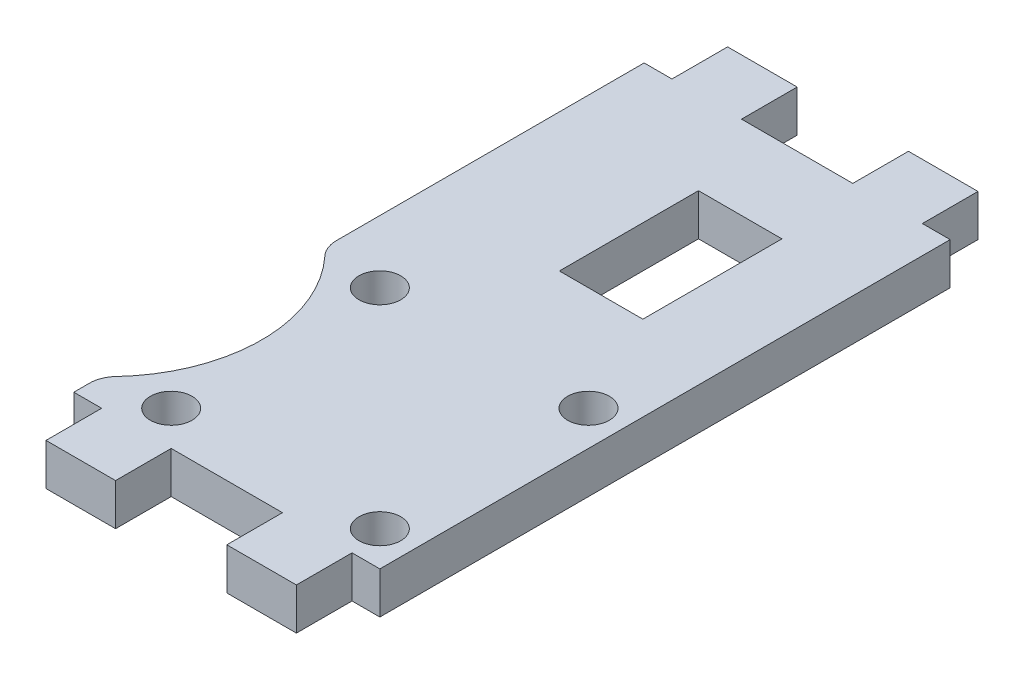
ISO-10303-21;
HEADER;
FILE_DESCRIPTION(('STEP AP214'),'2;1');
FILE_NAME('part.step','',(''),(''),'','','');
FILE_SCHEMA(('AUTOMOTIVE_DESIGN { 1 0 10303 214 1 1 1 1 }'));
ENDSEC;
DATA;
#1=APPLICATION_CONTEXT('core data for automotive mechanical design processes');
#2=APPLICATION_PROTOCOL_DEFINITION('international standard','automotive_design',2000,#1);
#3=PRODUCT_CONTEXT('',#1,'mechanical');
#4=PRODUCT('Part','Part','',(#3));
#5=PRODUCT_RELATED_PRODUCT_CATEGORY('part','',(#4));
#6=PRODUCT_DEFINITION_FORMATION('','',#4);
#7=PRODUCT_DEFINITION_CONTEXT('part definition',#1,'design');
#8=PRODUCT_DEFINITION('design','',#6,#7);
#9=PRODUCT_DEFINITION_SHAPE('','',#8);
#10=(LENGTH_UNIT() NAMED_UNIT(*) SI_UNIT(.MILLI.,.METRE.));
#11=(NAMED_UNIT(*) PLANE_ANGLE_UNIT() SI_UNIT($,.RADIAN.));
#12=(NAMED_UNIT(*) SI_UNIT($,.STERADIAN.) SOLID_ANGLE_UNIT());
#13=UNCERTAINTY_MEASURE_WITH_UNIT(LENGTH_MEASURE(1.E-05),#10,'distance_accuracy_value','');
#14=(GEOMETRIC_REPRESENTATION_CONTEXT(3) GLOBAL_UNCERTAINTY_ASSIGNED_CONTEXT((#13)) GLOBAL_UNIT_ASSIGNED_CONTEXT((#10,
#11,#12)) REPRESENTATION_CONTEXT('',''));
#15=CARTESIAN_POINT('',(0.,0.,0.));
#16=DIRECTION('',(0.,0.,1.));
#17=DIRECTION('',(1.,0.,0.));
#18=AXIS2_PLACEMENT_3D('',#15,#16,#17);
#19=CARTESIAN_POINT('',(-11.,3.,20.5));
#20=DIRECTION('',(1.,0.,0.));
#21=DIRECTION('',(0.,0.,-1.));
#22=AXIS2_PLACEMENT_3D('',#19,#20,#21);
#23=PLANE('',#22);
#24=DIRECTION('',(0.,0.,1.));
#25=VECTOR('',#24,1.);
#26=CARTESIAN_POINT('',(-11.,3.,20.5));
#27=LINE('',#26,#25);
#28=CARTESIAN_POINT('',(-11.,3.,19.3741196746494));
#29=VERTEX_POINT('',#28);
#30=CARTESIAN_POINT('',(-11.,3.,20.5));
#31=VERTEX_POINT('',#30);
#32=EDGE_CURVE('E388',#29,#31,#27,.T.);
#33=ORIENTED_EDGE('',*,*,#32,.F.);
#34=DIRECTION('',(0.,-1.,0.));
#35=VECTOR('',#34,1.);
#36=CARTESIAN_POINT('',(-11.,3.,19.3741196746494));
#37=LINE('',#36,#35);
#38=CARTESIAN_POINT('',(-11.,0.,19.3741196746494));
#39=VERTEX_POINT('',#38);
#40=EDGE_CURVE('E422',#29,#39,#37,.T.);
#41=ORIENTED_EDGE('',*,*,#40,.T.);
#42=DIRECTION('',(0.,0.,1.));
#43=VECTOR('',#42,1.);
#44=CARTESIAN_POINT('',(-11.,0.,20.5));
#45=LINE('',#44,#43);
#46=CARTESIAN_POINT('',(-11.,0.,20.5));
#47=VERTEX_POINT('',#46);
#48=EDGE_CURVE('E406',#39,#47,#45,.T.);
#49=ORIENTED_EDGE('',*,*,#48,.T.);
#50=DIRECTION('',(0.,-1.,0.));
#51=VECTOR('',#50,1.);
#52=CARTESIAN_POINT('',(-11.,3.,20.5));
#53=LINE('',#52,#51);
#54=EDGE_CURVE('E418',#31,#47,#53,.T.);
#55=ORIENTED_EDGE('',*,*,#54,.F.);
#56=EDGE_LOOP('',(#33,#41,#49,#55));
#57=FACE_BOUND('',#56,.T.);
#58=ADVANCED_FACE('F44',(#57),#23,.F.);
#59=CARTESIAN_POINT('',(-11.,3.,20.5));
#60=DIRECTION('',(0.,0.,-1.));
#61=DIRECTION('',(-1.,0.,0.));
#62=AXIS2_PLACEMENT_3D('',#59,#60,#61);
#63=PLANE('',#62);
#64=DIRECTION('',(1.,0.,0.));
#65=VECTOR('',#64,1.);
#66=CARTESIAN_POINT('',(-11.,3.,20.5));
#67=LINE('',#66,#65);
#68=CARTESIAN_POINT('',(-4.00000000000001,3.,20.5));
#69=VERTEX_POINT('',#68);
#70=CARTESIAN_POINT('',(3.99999999999999,3.,20.5));
#71=VERTEX_POINT('',#70);
#72=EDGE_CURVE('E399',#69,#71,#67,.T.);
#73=ORIENTED_EDGE('',*,*,#72,.F.);
#74=DIRECTION('',(0.,1.,0.));
#75=VECTOR('',#74,1.);
#76=CARTESIAN_POINT('',(-4.00000000000001,-6.40312423743285,20.5));
#77=LINE('',#76,#75);
#78=CARTESIAN_POINT('',(-4.00000000000001,0.,20.5));
#79=VERTEX_POINT('',#78);
#80=EDGE_CURVE('E296',#79,#69,#77,.T.);
#81=ORIENTED_EDGE('',*,*,#80,.F.);
#82=DIRECTION('',(1.,0.,0.));
#83=VECTOR('',#82,1.);
#84=CARTESIAN_POINT('',(-11.,0.,20.5));
#85=LINE('',#84,#83);
#86=CARTESIAN_POINT('',(3.99999999999999,0.,20.5));
#87=VERTEX_POINT('',#86);
#88=EDGE_CURVE('E412',#79,#87,#85,.T.);
#89=ORIENTED_EDGE('',*,*,#88,.T.);
#90=DIRECTION('',(0.,1.,0.));
#91=VECTOR('',#90,1.);
#92=CARTESIAN_POINT('',(3.99999999999999,-6.40312423743285,20.5));
#93=LINE('',#92,#91);
#94=EDGE_CURVE('E317',#87,#71,#93,.T.);
#95=ORIENTED_EDGE('',*,*,#94,.T.);
#96=EDGE_LOOP('',(#73,#81,#89,#95));
#97=FACE_BOUND('',#96,.T.);
#98=ADVANCED_FACE('F496',(#97),#63,.F.);
#99=DIRECTION('',(0.,1.,0.));
#100=VECTOR('',#99,1.);
#101=CARTESIAN_POINT('',(8.99999999999997,-6.40312423743285,20.5));
#102=LINE('',#101,#100);
#103=CARTESIAN_POINT('',(8.99999999999997,0.,20.5));
#104=VERTEX_POINT('',#103);
#105=CARTESIAN_POINT('',(8.99999999999997,3.,20.5));
#106=VERTEX_POINT('',#105);
#107=EDGE_CURVE('E325',#104,#106,#102,.T.);
#108=ORIENTED_EDGE('',*,*,#107,.F.);
#109=CARTESIAN_POINT('',(11.,0.,20.5));
#110=VERTEX_POINT('',#109);
#111=EDGE_CURVE('E411',#104,#110,#85,.T.);
#112=ORIENTED_EDGE('',*,*,#111,.T.);
#113=DIRECTION('',(0.,-1.,0.));
#114=VECTOR('',#113,1.);
#115=CARTESIAN_POINT('',(11.,3.,20.5));
#116=LINE('',#115,#114);
#117=CARTESIAN_POINT('',(11.,3.,20.5));
#118=VERTEX_POINT('',#117);
#119=EDGE_CURVE('E398',#118,#110,#116,.T.);
#120=ORIENTED_EDGE('',*,*,#119,.F.);
#121=EDGE_CURVE('E395',#106,#118,#67,.T.);
#122=ORIENTED_EDGE('',*,*,#121,.F.);
#123=EDGE_LOOP('',(#108,#112,#120,#122));
#124=FACE_BOUND('',#123,.T.);
#125=ADVANCED_FACE('F498',(#124),#63,.F.);
#126=CARTESIAN_POINT('',(-11.,3.,-20.5));
#127=DIRECTION('',(0.,0.,1.));
#128=DIRECTION('',(1.,0.,0.));
#129=AXIS2_PLACEMENT_3D('',#126,#127,#128);
#130=PLANE('',#129);
#131=DIRECTION('',(-1.,0.,0.));
#132=VECTOR('',#131,1.);
#133=CARTESIAN_POINT('',(-11.,0.,-20.5));
#134=LINE('',#133,#132);
#135=CARTESIAN_POINT('',(11.,0.,-20.5));
#136=VERTEX_POINT('',#135);
#137=CARTESIAN_POINT('',(9.,0.,-20.5));
#138=VERTEX_POINT('',#137);
#139=EDGE_CURVE('E404',#136,#138,#134,.T.);
#140=ORIENTED_EDGE('',*,*,#139,.T.);
#141=DIRECTION('',(0.,1.,0.));
#142=VECTOR('',#141,1.);
#143=CARTESIAN_POINT('',(9.,-6.40312423743285,-20.5));
#144=LINE('',#143,#142);
#145=CARTESIAN_POINT('',(9.,3.,-20.5));
#146=VERTEX_POINT('',#145);
#147=EDGE_CURVE('E335',#138,#146,#144,.T.);
#148=ORIENTED_EDGE('',*,*,#147,.T.);
#149=DIRECTION('',(-1.,0.,0.));
#150=VECTOR('',#149,1.);
#151=CARTESIAN_POINT('',(-11.,3.,-20.5));
#152=LINE('',#151,#150);
#153=CARTESIAN_POINT('',(11.,3.,-20.5));
#154=VERTEX_POINT('',#153);
#155=EDGE_CURVE('E390',#154,#146,#152,.T.);
#156=ORIENTED_EDGE('',*,*,#155,.F.);
#157=DIRECTION('',(0.,-1.,0.));
#158=VECTOR('',#157,1.);
#159=CARTESIAN_POINT('',(11.,3.,-20.5));
#160=LINE('',#159,#158);
#161=EDGE_CURVE('E425',#154,#136,#160,.T.);
#162=ORIENTED_EDGE('',*,*,#161,.T.);
#163=EDGE_LOOP('',(#140,#148,#156,#162));
#164=FACE_BOUND('',#163,.T.);
#165=ADVANCED_FACE('F520',(#164),#130,.F.);
#166=DIRECTION('',(0.,1.,0.));
#167=VECTOR('',#166,1.);
#168=CARTESIAN_POINT('',(-9.,-6.40312423743285,-20.5));
#169=LINE('',#168,#167);
#170=CARTESIAN_POINT('',(-9.,0.,-20.5));
#171=VERTEX_POINT('',#170);
#172=CARTESIAN_POINT('',(-9.,3.,-20.5));
#173=VERTEX_POINT('',#172);
#174=EDGE_CURVE('E370',#171,#173,#169,.T.);
#175=ORIENTED_EDGE('',*,*,#174,.F.);
#176=CARTESIAN_POINT('',(-11.,0.,-20.5));
#177=VERTEX_POINT('',#176);
#178=EDGE_CURVE('E401',#171,#177,#134,.T.);
#179=ORIENTED_EDGE('',*,*,#178,.T.);
#180=DIRECTION('',(0.,-1.,0.));
#181=VECTOR('',#180,1.);
#182=CARTESIAN_POINT('',(-11.,3.,-20.5));
#183=LINE('',#182,#181);
#184=CARTESIAN_POINT('',(-11.,3.,-20.5));
#185=VERTEX_POINT('',#184);
#186=EDGE_CURVE('E420',#185,#177,#183,.T.);
#187=ORIENTED_EDGE('',*,*,#186,.F.);
#188=EDGE_CURVE('E384',#173,#185,#152,.T.);
#189=ORIENTED_EDGE('',*,*,#188,.F.);
#190=EDGE_LOOP('',(#175,#179,#187,#189));
#191=FACE_BOUND('',#190,.T.);
#192=ADVANCED_FACE('F521',(#191),#130,.F.);
#193=CARTESIAN_POINT('',(11.,3.,20.5));
#194=DIRECTION('',(-1.,0.,0.));
#195=DIRECTION('',(0.,0.,1.));
#196=AXIS2_PLACEMENT_3D('',#193,#194,#195);
#197=PLANE('',#196);
#198=DIRECTION('',(0.,0.,-1.));
#199=VECTOR('',#198,1.);
#200=CARTESIAN_POINT('',(11.,0.,20.5));
#201=LINE('',#200,#199);
#202=EDGE_CURVE('E381',#110,#136,#201,.T.);
#203=ORIENTED_EDGE('',*,*,#202,.T.);
#204=ORIENTED_EDGE('',*,*,#161,.F.);
#205=DIRECTION('',(0.,0.,-1.));
#206=VECTOR('',#205,1.);
#207=CARTESIAN_POINT('',(11.,3.,20.5));
#208=LINE('',#207,#206);
#209=EDGE_CURVE('E385',#118,#154,#208,.T.);
#210=ORIENTED_EDGE('',*,*,#209,.F.);
#211=ORIENTED_EDGE('',*,*,#119,.T.);
#212=EDGE_LOOP('',(#203,#204,#210,#211));
#213=FACE_BOUND('',#212,.T.);
#214=ADVANCED_FACE('F519',(#213),#197,.F.);
#215=CARTESIAN_POINT('',(4.,3.,-20.5));
#216=VERTEX_POINT('',#215);
#217=CARTESIAN_POINT('',(-4.,3.,-20.5));
#218=VERTEX_POINT('',#217);
#219=EDGE_CURVE('E391',#216,#218,#152,.T.);
#220=ORIENTED_EDGE('',*,*,#219,.F.);
#221=DIRECTION('',(0.,1.,0.));
#222=VECTOR('',#221,1.);
#223=CARTESIAN_POINT('',(4.,-6.40312423743285,-20.5));
#224=LINE('',#223,#222);
#225=CARTESIAN_POINT('',(4.,0.,-20.5));
#226=VERTEX_POINT('',#225);
#227=EDGE_CURVE('E341',#226,#216,#224,.T.);
#228=ORIENTED_EDGE('',*,*,#227,.F.);
#229=CARTESIAN_POINT('',(-4.,0.,-20.5));
#230=VERTEX_POINT('',#229);
#231=EDGE_CURVE('E407',#226,#230,#134,.T.);
#232=ORIENTED_EDGE('',*,*,#231,.T.);
#233=DIRECTION('',(0.,1.,0.));
#234=VECTOR('',#233,1.);
#235=CARTESIAN_POINT('',(-4.,-6.40312423743285,-20.5));
#236=LINE('',#235,#234);
#237=EDGE_CURVE('E358',#230,#218,#236,.T.);
#238=ORIENTED_EDGE('',*,*,#237,.T.);
#239=EDGE_LOOP('',(#220,#228,#232,#238));
#240=FACE_BOUND('',#239,.T.);
#241=ADVANCED_FACE('F515',(#240),#130,.F.);
#242=CARTESIAN_POINT('',(-11.,0.,1.62588032535058));
#243=VERTEX_POINT('',#242);
#244=EDGE_CURVE('E409',#177,#243,#45,.T.);
#245=ORIENTED_EDGE('',*,*,#244,.T.);
#246=DIRECTION('',(0.,-1.,0.));
#247=VECTOR('',#246,1.);
#248=CARTESIAN_POINT('',(-11.,3.,1.62588032535058));
#249=LINE('',#248,#247);
#250=CARTESIAN_POINT('',(-11.,3.,1.62588032535058));
#251=VERTEX_POINT('',#250);
#252=EDGE_CURVE('E11',#243,#251,#249,.F.);
#253=ORIENTED_EDGE('',*,*,#252,.T.);
#254=EDGE_CURVE('E392',#185,#251,#27,.T.);
#255=ORIENTED_EDGE('',*,*,#254,.F.);
#256=ORIENTED_EDGE('',*,*,#186,.T.);
#257=EDGE_LOOP('',(#245,#253,#255,#256));
#258=FACE_BOUND('',#257,.T.);
#259=ADVANCED_FACE('F497',(#258),#23,.F.);
#260=CARTESIAN_POINT('',(-9.00000000000001,0.,20.5));
#261=VERTEX_POINT('',#260);
#262=EDGE_CURVE('E387',#47,#261,#85,.T.);
#263=ORIENTED_EDGE('',*,*,#262,.T.);
#264=DIRECTION('',(0.,1.,0.));
#265=VECTOR('',#264,1.);
#266=CARTESIAN_POINT('',(-9.00000000000001,-6.40312423743285,20.5));
#267=LINE('',#266,#265);
#268=CARTESIAN_POINT('',(-9.00000000000001,3.,20.5));
#269=VERTEX_POINT('',#268);
#270=EDGE_CURVE('E295',#261,#269,#267,.T.);
#271=ORIENTED_EDGE('',*,*,#270,.T.);
#272=EDGE_CURVE('E396',#31,#269,#67,.T.);
#273=ORIENTED_EDGE('',*,*,#272,.F.);
#274=ORIENTED_EDGE('',*,*,#54,.T.);
#275=EDGE_LOOP('',(#263,#271,#273,#274));
#276=FACE_BOUND('',#275,.T.);
#277=ADVANCED_FACE('F490',(#276),#63,.F.);
#278=CARTESIAN_POINT('',(0.,3.,0.));
#279=DIRECTION('',(0.,-1.,0.));
#280=DIRECTION('',(0.,0.,-1.));
#281=AXIS2_PLACEMENT_3D('',#278,#279,#280);
#282=PLANE('',#281);
#283=CARTESIAN_POINT('',(8.5,3.,18.));
#284=DIRECTION('',(0.,-1.,0.));
#285=DIRECTION('',(0.,0.,-1.));
#286=AXIS2_PLACEMENT_3D('',#283,#284,#285);
#287=CIRCLE('',#286,1.5);
#288=CARTESIAN_POINT('',(8.5,3.,16.5));
#289=VERTEX_POINT('',#288);
#290=EDGE_CURVE('E476',#289,#289,#287,.T.);
#291=ORIENTED_EDGE('',*,*,#290,.T.);
#292=EDGE_LOOP('',(#291));
#293=FACE_BOUND('',#292,.T.);
#294=CARTESIAN_POINT('',(-6.5,3.,3.));
#295=DIRECTION('',(0.,-1.,0.));
#296=DIRECTION('',(0.,0.,-1.));
#297=AXIS2_PLACEMENT_3D('',#294,#295,#296);
#298=CIRCLE('',#297,1.5);
#299=CARTESIAN_POINT('',(-6.5,3.,1.5));
#300=VERTEX_POINT('',#299);
#301=EDGE_CURVE('E474',#300,#300,#298,.T.);
#302=ORIENTED_EDGE('',*,*,#301,.T.);
#303=EDGE_LOOP('',(#302));
#304=FACE_BOUND('',#303,.T.);
#305=CARTESIAN_POINT('',(8.5,3.,3.));
#306=DIRECTION('',(0.,-1.,0.));
#307=DIRECTION('',(0.,0.,-1.));
#308=AXIS2_PLACEMENT_3D('',#305,#306,#307);
#309=CIRCLE('',#308,1.5);
#310=CARTESIAN_POINT('',(8.5,3.,1.5));
#311=VERTEX_POINT('',#310);
#312=EDGE_CURVE('E472',#311,#311,#309,.T.);
#313=ORIENTED_EDGE('',*,*,#312,.T.);
#314=EDGE_LOOP('',(#313));
#315=FACE_BOUND('',#314,.T.);
#316=CARTESIAN_POINT('',(-6.5,3.,18.));
#317=DIRECTION('',(0.,-1.,0.));
#318=DIRECTION('',(0.,0.,-1.));
#319=AXIS2_PLACEMENT_3D('',#316,#317,#318);
#320=CIRCLE('',#319,1.5);
#321=CARTESIAN_POINT('',(-6.5,3.,16.5));
#322=VERTEX_POINT('',#321);
#323=EDGE_CURVE('E468',#322,#322,#320,.T.);
#324=ORIENTED_EDGE('',*,*,#323,.T.);
#325=EDGE_LOOP('',(#324));
#326=FACE_BOUND('',#325,.T.);
#327=DIRECTION('',(-1.,0.,0.));
#328=VECTOR('',#327,1.);
#329=CARTESIAN_POINT('',(0.,3.,-4.49999999998977));
#330=LINE('',#329,#328);
#331=CARTESIAN_POINT('',(4.90620411774481,3.,-4.49999999998977));
#332=VERTEX_POINT('',#331);
#333=CARTESIAN_POINT('',(-1.09379588225519,3.,-4.49999999998977));
#334=VERTEX_POINT('',#333);
#335=EDGE_CURVE('E267',#332,#334,#330,.T.);
#336=ORIENTED_EDGE('',*,*,#335,.T.);
#337=DIRECTION('',(0.,0.,-1.));
#338=VECTOR('',#337,1.);
#339=CARTESIAN_POINT('',(-1.09379588225519,3.,0.));
#340=LINE('',#339,#338);
#341=CARTESIAN_POINT('',(-1.09379588225519,3.,-14.4999999999898));
#342=VERTEX_POINT('',#341);
#343=EDGE_CURVE('E275',#334,#342,#340,.T.);
#344=ORIENTED_EDGE('',*,*,#343,.T.);
#345=DIRECTION('',(1.,0.,0.));
#346=VECTOR('',#345,1.);
#347=CARTESIAN_POINT('',(0.,3.,-14.4999999999898));
#348=LINE('',#347,#346);
#349=CARTESIAN_POINT('',(4.90620411774481,3.,-14.4999999999898));
#350=VERTEX_POINT('',#349);
#351=EDGE_CURVE('E262',#342,#350,#348,.T.);
#352=ORIENTED_EDGE('',*,*,#351,.T.);
#353=DIRECTION('',(0.,0.,1.));
#354=VECTOR('',#353,1.);
#355=CARTESIAN_POINT('',(4.90620411774481,3.,0.));
#356=LINE('',#355,#354);
#357=EDGE_CURVE('E238',#350,#332,#356,.T.);
#358=ORIENTED_EDGE('',*,*,#357,.T.);
#359=EDGE_LOOP('',(#336,#344,#352,#358));
#360=FACE_BOUND('',#359,.T.);
#361=CARTESIAN_POINT('',(-18.5,3.,10.5));
#362=DIRECTION('',(0.,-1.,0.));
#363=DIRECTION('',(0.,0.,-1.));
#364=AXIS2_PLACEMENT_3D('',#361,#362,#363);
#365=CIRCLE('',#364,11.);
#366=CARTESIAN_POINT('',(-10.4615384615385,3.,2.99112950606588));
#367=VERTEX_POINT('',#366);
#368=CARTESIAN_POINT('',(-10.4615384615385,3.,18.0088704939341));
#369=VERTEX_POINT('',#368);
#370=EDGE_CURVE('E439',#367,#369,#365,.T.);
#371=ORIENTED_EDGE('',*,*,#370,.T.);
#372=CARTESIAN_POINT('',(-9.,3.,19.3741196746494));
#373=DIRECTION('',(0.,-1.,0.));
#374=DIRECTION('',(0.,0.,-1.));
#375=AXIS2_PLACEMENT_3D('',#372,#373,#374);
#376=CIRCLE('',#375,2.);
#377=EDGE_CURVE('E52',#369,#29,#376,.F.);
#378=ORIENTED_EDGE('',*,*,#377,.T.);
#379=ORIENTED_EDGE('',*,*,#32,.T.);
#380=ORIENTED_EDGE('',*,*,#272,.T.);
#381=DIRECTION('',(0.,0.,1.));
#382=VECTOR('',#381,1.);
#383=CARTESIAN_POINT('',(-9.00000000000001,3.,20.5));
#384=LINE('',#383,#382);
#385=CARTESIAN_POINT('',(-9.00000000000001,3.,24.5));
#386=VERTEX_POINT('',#385);
#387=EDGE_CURVE('E274',#269,#386,#384,.T.);
#388=ORIENTED_EDGE('',*,*,#387,.T.);
#389=DIRECTION('',(1.,0.,0.));
#390=VECTOR('',#389,1.);
#391=CARTESIAN_POINT('',(-9.00000000000001,3.,24.5));
#392=LINE('',#391,#390);
#393=CARTESIAN_POINT('',(-4.00000000000001,3.,24.5));
#394=VERTEX_POINT('',#393);
#395=EDGE_CURVE('E278',#386,#394,#392,.T.);
#396=ORIENTED_EDGE('',*,*,#395,.T.);
#397=DIRECTION('',(0.,0.,-1.));
#398=VECTOR('',#397,1.);
#399=CARTESIAN_POINT('',(-4.00000000000001,3.,20.5));
#400=LINE('',#399,#398);
#401=EDGE_CURVE('E277',#394,#69,#400,.T.);
#402=ORIENTED_EDGE('',*,*,#401,.T.);
#403=ORIENTED_EDGE('',*,*,#72,.T.);
#404=DIRECTION('',(0.,0.,1.));
#405=VECTOR('',#404,1.);
#406=CARTESIAN_POINT('',(3.99999999999999,3.,20.5));
#407=LINE('',#406,#405);
#408=CARTESIAN_POINT('',(3.99999999999999,3.,24.5));
#409=VERTEX_POINT('',#408);
#410=EDGE_CURVE('E305',#71,#409,#407,.T.);
#411=ORIENTED_EDGE('',*,*,#410,.T.);
#412=DIRECTION('',(1.,0.,0.));
#413=VECTOR('',#412,1.);
#414=CARTESIAN_POINT('',(3.99999999999999,3.,24.5));
#415=LINE('',#414,#413);
#416=CARTESIAN_POINT('',(8.99999999999997,3.,24.5));
#417=VERTEX_POINT('',#416);
#418=EDGE_CURVE('E307',#409,#417,#415,.T.);
#419=ORIENTED_EDGE('',*,*,#418,.T.);
#420=DIRECTION('',(0.,0.,-1.));
#421=VECTOR('',#420,1.);
#422=CARTESIAN_POINT('',(8.99999999999997,3.,20.5));
#423=LINE('',#422,#421);
#424=EDGE_CURVE('E302',#417,#106,#423,.T.);
#425=ORIENTED_EDGE('',*,*,#424,.T.);
#426=ORIENTED_EDGE('',*,*,#121,.T.);
#427=ORIENTED_EDGE('',*,*,#209,.T.);
#428=ORIENTED_EDGE('',*,*,#155,.T.);
#429=DIRECTION('',(0.,0.,-1.));
#430=VECTOR('',#429,1.);
#431=CARTESIAN_POINT('',(9.,3.,-20.5));
#432=LINE('',#431,#430);
#433=CARTESIAN_POINT('',(9.,3.,-24.5));
#434=VERTEX_POINT('',#433);
#435=EDGE_CURVE('E334',#146,#434,#432,.T.);
#436=ORIENTED_EDGE('',*,*,#435,.T.);
#437=DIRECTION('',(-1.,0.,0.));
#438=VECTOR('',#437,1.);
#439=CARTESIAN_POINT('',(4.,3.,-24.5));
#440=LINE('',#439,#438);
#441=CARTESIAN_POINT('',(4.,3.,-24.5));
#442=VERTEX_POINT('',#441);
#443=EDGE_CURVE('E328',#434,#442,#440,.T.);
#444=ORIENTED_EDGE('',*,*,#443,.T.);
#445=DIRECTION('',(0.,0.,1.));
#446=VECTOR('',#445,1.);
#447=CARTESIAN_POINT('',(4.,3.,-20.5));
#448=LINE('',#447,#446);
#449=EDGE_CURVE('E327',#442,#216,#448,.T.);
#450=ORIENTED_EDGE('',*,*,#449,.T.);
#451=ORIENTED_EDGE('',*,*,#219,.T.);
#452=DIRECTION('',(0.,0.,-1.));
#453=VECTOR('',#452,1.);
#454=CARTESIAN_POINT('',(-4.,3.,-20.5));
#455=LINE('',#454,#453);
#456=CARTESIAN_POINT('',(-4.,3.,-24.5));
#457=VERTEX_POINT('',#456);
#458=EDGE_CURVE('E359',#218,#457,#455,.T.);
#459=ORIENTED_EDGE('',*,*,#458,.T.);
#460=DIRECTION('',(-1.,0.,0.));
#461=VECTOR('',#460,1.);
#462=CARTESIAN_POINT('',(-9.,3.,-24.5));
#463=LINE('',#462,#461);
#464=CARTESIAN_POINT('',(-9.,3.,-24.5));
#465=VERTEX_POINT('',#464);
#466=EDGE_CURVE('E356',#457,#465,#463,.T.);
#467=ORIENTED_EDGE('',*,*,#466,.T.);
#468=DIRECTION('',(0.,0.,1.));
#469=VECTOR('',#468,1.);
#470=CARTESIAN_POINT('',(-9.,3.,-20.5));
#471=LINE('',#470,#469);
#472=EDGE_CURVE('E355',#465,#173,#471,.T.);
#473=ORIENTED_EDGE('',*,*,#472,.T.);
#474=ORIENTED_EDGE('',*,*,#188,.T.);
#475=ORIENTED_EDGE('',*,*,#254,.T.);
#476=CARTESIAN_POINT('',(-9.,3.,1.62588032535058));
#477=DIRECTION('',(0.,-1.,0.));
#478=DIRECTION('',(0.,0.,-1.));
#479=AXIS2_PLACEMENT_3D('',#476,#477,#478);
#480=CIRCLE('',#479,2.);
#481=EDGE_CURVE('E58',#251,#367,#480,.F.);
#482=ORIENTED_EDGE('',*,*,#481,.T.);
#483=EDGE_LOOP('',(#371,#378,#379,#380,#388,#396,#402,#403,#411,#419,#425,#426,#427,#428,#436,
#444,#450,#451,#459,#467,#473,#474,#475,#482));
#484=FACE_BOUND('',#483,.T.);
#485=ADVANCED_FACE('F437',(#293,#304,#315,#326,#360,#484),#282,.F.);
#486=CARTESIAN_POINT('',(0.,0.,0.));
#487=DIRECTION('',(0.,-1.,0.));
#488=DIRECTION('',(0.,0.,-1.));
#489=AXIS2_PLACEMENT_3D('',#486,#487,#488);
#490=PLANE('',#489);
#491=ORIENTED_EDGE('',*,*,#48,.F.);
#492=CARTESIAN_POINT('',(-9.,0.,19.3741196746494));
#493=DIRECTION('',(0.,-1.,0.));
#494=DIRECTION('',(0.,0.,-1.));
#495=AXIS2_PLACEMENT_3D('',#492,#493,#494);
#496=CIRCLE('',#495,2.);
#497=CARTESIAN_POINT('',(-10.4615384615385,0.,18.0088704939341));
#498=VERTEX_POINT('',#497);
#499=EDGE_CURVE('E429',#39,#498,#496,.T.);
#500=ORIENTED_EDGE('',*,*,#499,.T.);
#501=CARTESIAN_POINT('',(-18.5,0.,10.5));
#502=DIRECTION('',(0.,-1.,0.));
#503=DIRECTION('',(0.,0.,-1.));
#504=AXIS2_PLACEMENT_3D('',#501,#502,#503);
#505=CIRCLE('',#504,11.);
#506=CARTESIAN_POINT('',(-10.4615384615385,0.,2.99112950606588));
#507=VERTEX_POINT('',#506);
#508=EDGE_CURVE('E450',#507,#498,#505,.T.);
#509=ORIENTED_EDGE('',*,*,#508,.F.);
#510=CARTESIAN_POINT('',(-9.,0.,1.62588032535058));
#511=DIRECTION('',(0.,-1.,0.));
#512=DIRECTION('',(0.,0.,-1.));
#513=AXIS2_PLACEMENT_3D('',#510,#511,#512);
#514=CIRCLE('',#513,2.);
#515=EDGE_CURVE('E428',#507,#243,#514,.T.);
#516=ORIENTED_EDGE('',*,*,#515,.T.);
#517=ORIENTED_EDGE('',*,*,#244,.F.);
#518=ORIENTED_EDGE('',*,*,#178,.F.);
#519=DIRECTION('',(0.,0.,1.));
#520=VECTOR('',#519,1.);
#521=CARTESIAN_POINT('',(-9.,0.,-20.5));
#522=LINE('',#521,#520);
#523=CARTESIAN_POINT('',(-9.,0.,-24.5));
#524=VERTEX_POINT('',#523);
#525=EDGE_CURVE('E364',#524,#171,#522,.T.);
#526=ORIENTED_EDGE('',*,*,#525,.F.);
#527=DIRECTION('',(-1.,0.,0.));
#528=VECTOR('',#527,1.);
#529=CARTESIAN_POINT('',(-9.,0.,-24.5));
#530=LINE('',#529,#528);
#531=CARTESIAN_POINT('',(-4.,0.,-24.5));
#532=VERTEX_POINT('',#531);
#533=EDGE_CURVE('E369',#532,#524,#530,.T.);
#534=ORIENTED_EDGE('',*,*,#533,.F.);
#535=DIRECTION('',(0.,0.,-1.));
#536=VECTOR('',#535,1.);
#537=CARTESIAN_POINT('',(-4.,0.,-20.5));
#538=LINE('',#537,#536);
#539=EDGE_CURVE('E373',#230,#532,#538,.T.);
#540=ORIENTED_EDGE('',*,*,#539,.F.);
#541=ORIENTED_EDGE('',*,*,#231,.F.);
#542=DIRECTION('',(0.,0.,1.));
#543=VECTOR('',#542,1.);
#544=CARTESIAN_POINT('',(4.,0.,-20.5));
#545=LINE('',#544,#543);
#546=CARTESIAN_POINT('',(4.,0.,-24.5));
#547=VERTEX_POINT('',#546);
#548=EDGE_CURVE('E339',#547,#226,#545,.T.);
#549=ORIENTED_EDGE('',*,*,#548,.F.);
#550=DIRECTION('',(-1.,0.,0.));
#551=VECTOR('',#550,1.);
#552=CARTESIAN_POINT('',(4.,0.,-24.5));
#553=LINE('',#552,#551);
#554=CARTESIAN_POINT('',(9.,0.,-24.5));
#555=VERTEX_POINT('',#554);
#556=EDGE_CURVE('E342',#555,#547,#553,.T.);
#557=ORIENTED_EDGE('',*,*,#556,.F.);
#558=DIRECTION('',(0.,0.,-1.));
#559=VECTOR('',#558,1.);
#560=CARTESIAN_POINT('',(9.,0.,-20.5));
#561=LINE('',#560,#559);
#562=EDGE_CURVE('E350',#138,#555,#561,.T.);
#563=ORIENTED_EDGE('',*,*,#562,.F.);
#564=ORIENTED_EDGE('',*,*,#139,.F.);
#565=ORIENTED_EDGE('',*,*,#202,.F.);
#566=ORIENTED_EDGE('',*,*,#111,.F.);
#567=DIRECTION('',(0.,0.,-1.));
#568=VECTOR('',#567,1.);
#569=CARTESIAN_POINT('',(8.99999999999997,0.,20.5));
#570=LINE('',#569,#568);
#571=CARTESIAN_POINT('',(8.99999999999997,0.,24.5));
#572=VERTEX_POINT('',#571);
#573=EDGE_CURVE('E319',#572,#104,#570,.T.);
#574=ORIENTED_EDGE('',*,*,#573,.F.);
#575=DIRECTION('',(1.,0.,0.));
#576=VECTOR('',#575,1.);
#577=CARTESIAN_POINT('',(3.99999999999999,0.,24.5));
#578=LINE('',#577,#576);
#579=CARTESIAN_POINT('',(3.99999999999999,0.,24.5));
#580=VERTEX_POINT('',#579);
#581=EDGE_CURVE('E308',#580,#572,#578,.T.);
#582=ORIENTED_EDGE('',*,*,#581,.F.);
#583=DIRECTION('',(0.,0.,1.));
#584=VECTOR('',#583,1.);
#585=CARTESIAN_POINT('',(3.99999999999999,0.,20.5));
#586=LINE('',#585,#584);
#587=EDGE_CURVE('E312',#87,#580,#586,.T.);
#588=ORIENTED_EDGE('',*,*,#587,.F.);
#589=ORIENTED_EDGE('',*,*,#88,.F.);
#590=DIRECTION('',(0.,0.,-1.));
#591=VECTOR('',#590,1.);
#592=CARTESIAN_POINT('',(-4.00000000000001,0.,20.5));
#593=LINE('',#592,#591);
#594=CARTESIAN_POINT('',(-4.00000000000001,0.,24.5));
#595=VERTEX_POINT('',#594);
#596=EDGE_CURVE('E291',#595,#79,#593,.T.);
#597=ORIENTED_EDGE('',*,*,#596,.F.);
#598=DIRECTION('',(1.,0.,0.));
#599=VECTOR('',#598,1.);
#600=CARTESIAN_POINT('',(-9.00000000000001,0.,24.5));
#601=LINE('',#600,#599);
#602=CARTESIAN_POINT('',(-9.00000000000001,0.,24.5));
#603=VERTEX_POINT('',#602);
#604=EDGE_CURVE('E276',#603,#595,#601,.T.);
#605=ORIENTED_EDGE('',*,*,#604,.F.);
#606=DIRECTION('',(0.,0.,1.));
#607=VECTOR('',#606,1.);
#608=CARTESIAN_POINT('',(-9.00000000000001,0.,20.5));
#609=LINE('',#608,#607);
#610=EDGE_CURVE('E287',#261,#603,#609,.T.);
#611=ORIENTED_EDGE('',*,*,#610,.F.);
#612=ORIENTED_EDGE('',*,*,#262,.F.);
#613=EDGE_LOOP('',(#491,#500,#509,#516,#517,#518,#526,#534,#540,#541,#549,#557,#563,#564,#565,
#566,#574,#582,#588,#589,#597,#605,#611,#612));
#614=FACE_BOUND('',#613,.T.);
#615=CARTESIAN_POINT('',(8.5,0.,18.));
#616=DIRECTION('',(0.,-1.,0.));
#617=DIRECTION('',(0.,0.,-1.));
#618=AXIS2_PLACEMENT_3D('',#615,#616,#617);
#619=CIRCLE('',#618,1.5);
#620=CARTESIAN_POINT('',(8.5,0.,16.5));
#621=VERTEX_POINT('',#620);
#622=EDGE_CURVE('E461',#621,#621,#619,.T.);
#623=ORIENTED_EDGE('',*,*,#622,.F.);
#624=EDGE_LOOP('',(#623));
#625=FACE_BOUND('',#624,.T.);
#626=CARTESIAN_POINT('',(-6.5,0.,3.));
#627=DIRECTION('',(0.,-1.,0.));
#628=DIRECTION('',(0.,0.,-1.));
#629=AXIS2_PLACEMENT_3D('',#626,#627,#628);
#630=CIRCLE('',#629,1.5);
#631=CARTESIAN_POINT('',(-6.5,0.,1.5));
#632=VERTEX_POINT('',#631);
#633=EDGE_CURVE('E458',#632,#632,#630,.T.);
#634=ORIENTED_EDGE('',*,*,#633,.F.);
#635=EDGE_LOOP('',(#634));
#636=FACE_BOUND('',#635,.T.);
#637=CARTESIAN_POINT('',(8.5,0.,3.));
#638=DIRECTION('',(0.,-1.,0.));
#639=DIRECTION('',(0.,0.,-1.));
#640=AXIS2_PLACEMENT_3D('',#637,#638,#639);
#641=CIRCLE('',#640,1.5);
#642=CARTESIAN_POINT('',(8.5,0.,1.5));
#643=VERTEX_POINT('',#642);
#644=EDGE_CURVE('E454',#643,#643,#641,.T.);
#645=ORIENTED_EDGE('',*,*,#644,.F.);
#646=EDGE_LOOP('',(#645));
#647=FACE_BOUND('',#646,.T.);
#648=CARTESIAN_POINT('',(-6.5,0.,18.));
#649=DIRECTION('',(0.,-1.,0.));
#650=DIRECTION('',(0.,0.,-1.));
#651=AXIS2_PLACEMENT_3D('',#648,#649,#650);
#652=CIRCLE('',#651,1.5);
#653=CARTESIAN_POINT('',(-6.5,0.,16.5));
#654=VERTEX_POINT('',#653);
#655=EDGE_CURVE('E463',#654,#654,#652,.T.);
#656=ORIENTED_EDGE('',*,*,#655,.F.);
#657=EDGE_LOOP('',(#656));
#658=FACE_BOUND('',#657,.T.);
#659=DIRECTION('',(0.,0.,-1.));
#660=VECTOR('',#659,1.);
#661=CARTESIAN_POINT('',(-1.09379588225519,0.,-14.4999999999898));
#662=LINE('',#661,#660);
#663=CARTESIAN_POINT('',(-1.09379588225519,0.,-4.49999999998977));
#664=VERTEX_POINT('',#663);
#665=CARTESIAN_POINT('',(-1.09379588225519,0.,-14.4999999999898));
#666=VERTEX_POINT('',#665);
#667=EDGE_CURVE('E251',#664,#666,#662,.T.);
#668=ORIENTED_EDGE('',*,*,#667,.F.);
#669=DIRECTION('',(-1.,0.,0.));
#670=VECTOR('',#669,1.);
#671=CARTESIAN_POINT('',(4.90620411774481,0.,-4.49999999998977));
#672=LINE('',#671,#670);
#673=CARTESIAN_POINT('',(4.90620411774481,0.,-4.49999999998977));
#674=VERTEX_POINT('',#673);
#675=EDGE_CURVE('E260',#674,#664,#672,.T.);
#676=ORIENTED_EDGE('',*,*,#675,.F.);
#677=DIRECTION('',(0.,0.,1.));
#678=VECTOR('',#677,1.);
#679=CARTESIAN_POINT('',(4.90620411774481,0.,-14.4999999999898));
#680=LINE('',#679,#678);
#681=CARTESIAN_POINT('',(4.90620411774481,0.,-14.4999999999898));
#682=VERTEX_POINT('',#681);
#683=EDGE_CURVE('E240',#682,#674,#680,.T.);
#684=ORIENTED_EDGE('',*,*,#683,.F.);
#685=DIRECTION('',(1.,0.,0.));
#686=VECTOR('',#685,1.);
#687=CARTESIAN_POINT('',(4.90620411774481,0.,-14.4999999999898));
#688=LINE('',#687,#686);
#689=EDGE_CURVE('E247',#666,#682,#688,.T.);
#690=ORIENTED_EDGE('',*,*,#689,.F.);
#691=EDGE_LOOP('',(#668,#676,#684,#690));
#692=FACE_BOUND('',#691,.T.);
#693=ADVANCED_FACE('F254',(#614,#625,#636,#647,#658,#692),#490,.T.);
#694=CARTESIAN_POINT('',(-4.,-6.40312423743285,-20.5));
#695=DIRECTION('',(1.,0.,0.));
#696=DIRECTION('',(0.,0.,-1.));
#697=AXIS2_PLACEMENT_3D('',#694,#695,#696);
#698=PLANE('',#697);
#699=ORIENTED_EDGE('',*,*,#237,.F.);
#700=ORIENTED_EDGE('',*,*,#539,.T.);
#701=DIRECTION('',(0.,1.,0.));
#702=VECTOR('',#701,1.);
#703=CARTESIAN_POINT('',(-4.,-6.40312423743285,-24.5));
#704=LINE('',#703,#702);
#705=EDGE_CURVE('E375',#532,#457,#704,.T.);
#706=ORIENTED_EDGE('',*,*,#705,.T.);
#707=ORIENTED_EDGE('',*,*,#458,.F.);
#708=EDGE_LOOP('',(#699,#700,#706,#707));
#709=FACE_BOUND('',#708,.T.);
#710=ADVANCED_FACE('F492',(#709),#698,.T.);
#711=CARTESIAN_POINT('',(-9.,-6.40312423743285,-24.5));
#712=DIRECTION('',(0.,0.,-1.));
#713=DIRECTION('',(-1.,0.,0.));
#714=AXIS2_PLACEMENT_3D('',#711,#712,#713);
#715=PLANE('',#714);
#716=ORIENTED_EDGE('',*,*,#705,.F.);
#717=ORIENTED_EDGE('',*,*,#533,.T.);
#718=DIRECTION('',(0.,1.,0.));
#719=VECTOR('',#718,1.);
#720=CARTESIAN_POINT('',(-9.,-6.40312423743285,-24.5));
#721=LINE('',#720,#719);
#722=EDGE_CURVE('E366',#524,#465,#721,.T.);
#723=ORIENTED_EDGE('',*,*,#722,.T.);
#724=ORIENTED_EDGE('',*,*,#466,.F.);
#725=EDGE_LOOP('',(#716,#717,#723,#724));
#726=FACE_BOUND('',#725,.T.);
#727=ADVANCED_FACE('F606',(#726),#715,.T.);
#728=CARTESIAN_POINT('',(-9.,-6.40312423743285,-20.5));
#729=DIRECTION('',(-1.,0.,0.));
#730=DIRECTION('',(0.,0.,1.));
#731=AXIS2_PLACEMENT_3D('',#728,#729,#730);
#732=PLANE('',#731);
#733=ORIENTED_EDGE('',*,*,#722,.F.);
#734=ORIENTED_EDGE('',*,*,#525,.T.);
#735=ORIENTED_EDGE('',*,*,#174,.T.);
#736=ORIENTED_EDGE('',*,*,#472,.F.);
#737=EDGE_LOOP('',(#733,#734,#735,#736));
#738=FACE_BOUND('',#737,.T.);
#739=ADVANCED_FACE('F604',(#738),#732,.T.);
#740=CARTESIAN_POINT('',(9.,-6.40312423743285,-20.5));
#741=DIRECTION('',(1.,0.,0.));
#742=DIRECTION('',(0.,0.,-1.));
#743=AXIS2_PLACEMENT_3D('',#740,#741,#742);
#744=PLANE('',#743);
#745=ORIENTED_EDGE('',*,*,#147,.F.);
#746=ORIENTED_EDGE('',*,*,#562,.T.);
#747=DIRECTION('',(0.,1.,0.));
#748=VECTOR('',#747,1.);
#749=CARTESIAN_POINT('',(9.,-6.40312423743285,-24.5));
#750=LINE('',#749,#748);
#751=EDGE_CURVE('E347',#555,#434,#750,.T.);
#752=ORIENTED_EDGE('',*,*,#751,.T.);
#753=ORIENTED_EDGE('',*,*,#435,.F.);
#754=EDGE_LOOP('',(#745,#746,#752,#753));
#755=FACE_BOUND('',#754,.T.);
#756=ADVANCED_FACE('F601',(#755),#744,.T.);
#757=CARTESIAN_POINT('',(4.,-6.40312423743285,-24.5));
#758=DIRECTION('',(0.,0.,-1.));
#759=DIRECTION('',(-1.,0.,0.));
#760=AXIS2_PLACEMENT_3D('',#757,#758,#759);
#761=PLANE('',#760);
#762=ORIENTED_EDGE('',*,*,#751,.F.);
#763=ORIENTED_EDGE('',*,*,#556,.T.);
#764=DIRECTION('',(0.,1.,0.));
#765=VECTOR('',#764,1.);
#766=CARTESIAN_POINT('',(4.,-6.40312423743285,-24.5));
#767=LINE('',#766,#765);
#768=EDGE_CURVE('E345',#547,#442,#767,.T.);
#769=ORIENTED_EDGE('',*,*,#768,.T.);
#770=ORIENTED_EDGE('',*,*,#443,.F.);
#771=EDGE_LOOP('',(#762,#763,#769,#770));
#772=FACE_BOUND('',#771,.T.);
#773=ADVANCED_FACE('F600',(#772),#761,.T.);
#774=CARTESIAN_POINT('',(4.,-6.40312423743285,-20.5));
#775=DIRECTION('',(-1.,0.,0.));
#776=DIRECTION('',(0.,0.,1.));
#777=AXIS2_PLACEMENT_3D('',#774,#775,#776);
#778=PLANE('',#777);
#779=ORIENTED_EDGE('',*,*,#768,.F.);
#780=ORIENTED_EDGE('',*,*,#548,.T.);
#781=ORIENTED_EDGE('',*,*,#227,.T.);
#782=ORIENTED_EDGE('',*,*,#449,.F.);
#783=EDGE_LOOP('',(#779,#780,#781,#782));
#784=FACE_BOUND('',#783,.T.);
#785=ADVANCED_FACE('F593',(#784),#778,.T.);
#786=CARTESIAN_POINT('',(3.99999999999999,-6.40312423743285,24.5));
#787=DIRECTION('',(0.,0.,1.));
#788=DIRECTION('',(1.,0.,0.));
#789=AXIS2_PLACEMENT_3D('',#786,#787,#788);
#790=PLANE('',#789);
#791=DIRECTION('',(0.,1.,0.));
#792=VECTOR('',#791,1.);
#793=CARTESIAN_POINT('',(3.99999999999999,-6.40312423743285,24.5));
#794=LINE('',#793,#792);
#795=EDGE_CURVE('E318',#580,#409,#794,.T.);
#796=ORIENTED_EDGE('',*,*,#795,.F.);
#797=ORIENTED_EDGE('',*,*,#581,.T.);
#798=DIRECTION('',(0.,1.,0.));
#799=VECTOR('',#798,1.);
#800=CARTESIAN_POINT('',(8.99999999999997,-6.40312423743285,24.5));
#801=LINE('',#800,#799);
#802=EDGE_CURVE('E314',#572,#417,#801,.T.);
#803=ORIENTED_EDGE('',*,*,#802,.T.);
#804=ORIENTED_EDGE('',*,*,#418,.F.);
#805=EDGE_LOOP('',(#796,#797,#803,#804));
#806=FACE_BOUND('',#805,.T.);
#807=ADVANCED_FACE('F589',(#806),#790,.T.);
#808=CARTESIAN_POINT('',(8.99999999999997,-6.40312423743285,20.5));
#809=DIRECTION('',(1.,0.,0.));
#810=DIRECTION('',(0.,0.,-1.));
#811=AXIS2_PLACEMENT_3D('',#808,#809,#810);
#812=PLANE('',#811);
#813=ORIENTED_EDGE('',*,*,#802,.F.);
#814=ORIENTED_EDGE('',*,*,#573,.T.);
#815=ORIENTED_EDGE('',*,*,#107,.T.);
#816=ORIENTED_EDGE('',*,*,#424,.F.);
#817=EDGE_LOOP('',(#813,#814,#815,#816));
#818=FACE_BOUND('',#817,.T.);
#819=ADVANCED_FACE('F581',(#818),#812,.T.);
#820=CARTESIAN_POINT('',(3.99999999999999,-6.40312423743285,20.5));
#821=DIRECTION('',(-1.,0.,0.));
#822=DIRECTION('',(0.,0.,1.));
#823=AXIS2_PLACEMENT_3D('',#820,#821,#822);
#824=PLANE('',#823);
#825=ORIENTED_EDGE('',*,*,#94,.F.);
#826=ORIENTED_EDGE('',*,*,#587,.T.);
#827=ORIENTED_EDGE('',*,*,#795,.T.);
#828=ORIENTED_EDGE('',*,*,#410,.F.);
#829=EDGE_LOOP('',(#825,#826,#827,#828));
#830=FACE_BOUND('',#829,.T.);
#831=ADVANCED_FACE('F561',(#830),#824,.T.);
#832=CARTESIAN_POINT('',(-9.00000000000001,-6.40312423743285,24.5));
#833=DIRECTION('',(0.,0.,1.));
#834=DIRECTION('',(1.,0.,0.));
#835=AXIS2_PLACEMENT_3D('',#832,#833,#834);
#836=PLANE('',#835);
#837=DIRECTION('',(0.,1.,0.));
#838=VECTOR('',#837,1.);
#839=CARTESIAN_POINT('',(-9.00000000000001,-6.40312423743285,24.5));
#840=LINE('',#839,#838);
#841=EDGE_CURVE('E292',#603,#386,#840,.T.);
#842=ORIENTED_EDGE('',*,*,#841,.F.);
#843=ORIENTED_EDGE('',*,*,#604,.T.);
#844=DIRECTION('',(0.,1.,0.));
#845=VECTOR('',#844,1.);
#846=CARTESIAN_POINT('',(-4.00000000000001,-6.40312423743285,24.5));
#847=LINE('',#846,#845);
#848=EDGE_CURVE('E290',#595,#394,#847,.T.);
#849=ORIENTED_EDGE('',*,*,#848,.T.);
#850=ORIENTED_EDGE('',*,*,#395,.F.);
#851=EDGE_LOOP('',(#842,#843,#849,#850));
#852=FACE_BOUND('',#851,.T.);
#853=ADVANCED_FACE('F575',(#852),#836,.T.);
#854=CARTESIAN_POINT('',(-4.00000000000001,-6.40312423743285,20.5));
#855=DIRECTION('',(1.,0.,0.));
#856=DIRECTION('',(0.,0.,-1.));
#857=AXIS2_PLACEMENT_3D('',#854,#855,#856);
#858=PLANE('',#857);
#859=ORIENTED_EDGE('',*,*,#848,.F.);
#860=ORIENTED_EDGE('',*,*,#596,.T.);
#861=ORIENTED_EDGE('',*,*,#80,.T.);
#862=ORIENTED_EDGE('',*,*,#401,.F.);
#863=EDGE_LOOP('',(#859,#860,#861,#862));
#864=FACE_BOUND('',#863,.T.);
#865=ADVANCED_FACE('F567',(#864),#858,.T.);
#866=CARTESIAN_POINT('',(-9.00000000000001,-6.40312423743285,20.5));
#867=DIRECTION('',(-1.,0.,0.));
#868=DIRECTION('',(0.,0.,1.));
#869=AXIS2_PLACEMENT_3D('',#866,#867,#868);
#870=PLANE('',#869);
#871=ORIENTED_EDGE('',*,*,#270,.F.);
#872=ORIENTED_EDGE('',*,*,#610,.T.);
#873=ORIENTED_EDGE('',*,*,#841,.T.);
#874=ORIENTED_EDGE('',*,*,#387,.F.);
#875=EDGE_LOOP('',(#871,#872,#873,#874));
#876=FACE_BOUND('',#875,.T.);
#877=ADVANCED_FACE('F572',(#876),#870,.T.);
#878=CARTESIAN_POINT('',(-1.09379588225519,10.,-14.4999999999898));
#879=DIRECTION('',(-1.,0.,0.));
#880=DIRECTION('',(0.,0.,1.));
#881=AXIS2_PLACEMENT_3D('',#878,#879,#880);
#882=PLANE('',#881);
#883=DIRECTION('',(0.,-1.,0.));
#884=VECTOR('',#883,1.);
#885=CARTESIAN_POINT('',(-1.09379588225519,10.,-4.49999999998977));
#886=LINE('',#885,#884);
#887=EDGE_CURVE('E265',#334,#664,#886,.T.);
#888=ORIENTED_EDGE('',*,*,#887,.T.);
#889=ORIENTED_EDGE('',*,*,#667,.T.);
#890=DIRECTION('',(0.,-1.,0.));
#891=VECTOR('',#890,1.);
#892=CARTESIAN_POINT('',(-1.09379588225519,10.,-14.4999999999898));
#893=LINE('',#892,#891);
#894=EDGE_CURVE('E243',#342,#666,#893,.T.);
#895=ORIENTED_EDGE('',*,*,#894,.F.);
#896=ORIENTED_EDGE('',*,*,#343,.F.);
#897=EDGE_LOOP('',(#888,#889,#895,#896));
#898=FACE_BOUND('',#897,.T.);
#899=ADVANCED_FACE('F481',(#898),#882,.F.);
#900=CARTESIAN_POINT('',(4.90620411774481,10.,-4.49999999998977));
#901=DIRECTION('',(0.,0.,1.));
#902=DIRECTION('',(1.,0.,0.));
#903=AXIS2_PLACEMENT_3D('',#900,#901,#902);
#904=PLANE('',#903);
#905=DIRECTION('',(0.,-1.,0.));
#906=VECTOR('',#905,1.);
#907=CARTESIAN_POINT('',(4.90620411774481,10.,-4.49999999998977));
#908=LINE('',#907,#906);
#909=EDGE_CURVE('E244',#332,#674,#908,.T.);
#910=ORIENTED_EDGE('',*,*,#909,.T.);
#911=ORIENTED_EDGE('',*,*,#675,.T.);
#912=ORIENTED_EDGE('',*,*,#887,.F.);
#913=ORIENTED_EDGE('',*,*,#335,.F.);
#914=EDGE_LOOP('',(#910,#911,#912,#913));
#915=FACE_BOUND('',#914,.T.);
#916=ADVANCED_FACE('F482',(#915),#904,.F.);
#917=CARTESIAN_POINT('',(4.90620411774481,10.,-14.4999999999898));
#918=DIRECTION('',(1.,0.,0.));
#919=DIRECTION('',(0.,0.,-1.));
#920=AXIS2_PLACEMENT_3D('',#917,#918,#919);
#921=PLANE('',#920);
#922=DIRECTION('',(0.,-1.,0.));
#923=VECTOR('',#922,1.);
#924=CARTESIAN_POINT('',(4.90620411774481,10.,-14.4999999999898));
#925=LINE('',#924,#923);
#926=EDGE_CURVE('E235',#350,#682,#925,.T.);
#927=ORIENTED_EDGE('',*,*,#926,.T.);
#928=ORIENTED_EDGE('',*,*,#683,.T.);
#929=ORIENTED_EDGE('',*,*,#909,.F.);
#930=ORIENTED_EDGE('',*,*,#357,.F.);
#931=EDGE_LOOP('',(#927,#928,#929,#930));
#932=FACE_BOUND('',#931,.T.);
#933=ADVANCED_FACE('F233',(#932),#921,.F.);
#934=CARTESIAN_POINT('',(4.90620411774481,10.,-14.4999999999898));
#935=DIRECTION('',(0.,0.,-1.));
#936=DIRECTION('',(-1.,0.,0.));
#937=AXIS2_PLACEMENT_3D('',#934,#935,#936);
#938=PLANE('',#937);
#939=ORIENTED_EDGE('',*,*,#894,.T.);
#940=ORIENTED_EDGE('',*,*,#689,.T.);
#941=ORIENTED_EDGE('',*,*,#926,.F.);
#942=ORIENTED_EDGE('',*,*,#351,.F.);
#943=EDGE_LOOP('',(#939,#940,#941,#942));
#944=FACE_BOUND('',#943,.T.);
#945=ADVANCED_FACE('F248',(#944),#938,.F.);
#946=CARTESIAN_POINT('',(-6.5,10.,18.));
#947=DIRECTION('',(0.,-1.,0.));
#948=DIRECTION('',(0.,0.,-1.));
#949=AXIS2_PLACEMENT_3D('',#946,#947,#948);
#950=CYLINDRICAL_SURFACE('',#949,1.5);
#951=ORIENTED_EDGE('',*,*,#655,.T.);
#952=EDGE_LOOP('',(#951));
#953=FACE_BOUND('',#952,.T.);
#954=ORIENTED_EDGE('',*,*,#323,.F.);
#955=EDGE_LOOP('',(#954));
#956=FACE_BOUND('',#955,.T.);
#957=ADVANCED_FACE('F705',(#953,#956),#950,.F.);
#958=CARTESIAN_POINT('',(8.5,10.,3.));
#959=DIRECTION('',(0.,-1.,0.));
#960=DIRECTION('',(0.,0.,-1.));
#961=AXIS2_PLACEMENT_3D('',#958,#959,#960);
#962=CYLINDRICAL_SURFACE('',#961,1.5);
#963=ORIENTED_EDGE('',*,*,#644,.T.);
#964=EDGE_LOOP('',(#963));
#965=FACE_BOUND('',#964,.T.);
#966=ORIENTED_EDGE('',*,*,#312,.F.);
#967=EDGE_LOOP('',(#966));
#968=FACE_BOUND('',#967,.T.);
#969=ADVANCED_FACE('F707',(#965,#968),#962,.F.);
#970=CARTESIAN_POINT('',(-6.5,10.,3.));
#971=DIRECTION('',(0.,-1.,0.));
#972=DIRECTION('',(0.,0.,-1.));
#973=AXIS2_PLACEMENT_3D('',#970,#971,#972);
#974=CYLINDRICAL_SURFACE('',#973,1.5);
#975=ORIENTED_EDGE('',*,*,#633,.T.);
#976=EDGE_LOOP('',(#975));
#977=FACE_BOUND('',#976,.T.);
#978=ORIENTED_EDGE('',*,*,#301,.F.);
#979=EDGE_LOOP('',(#978));
#980=FACE_BOUND('',#979,.T.);
#981=ADVANCED_FACE('F720',(#977,#980),#974,.F.);
#982=CARTESIAN_POINT('',(8.5,10.,18.));
#983=DIRECTION('',(0.,-1.,0.));
#984=DIRECTION('',(0.,0.,-1.));
#985=AXIS2_PLACEMENT_3D('',#982,#983,#984);
#986=CYLINDRICAL_SURFACE('',#985,1.5);
#987=ORIENTED_EDGE('',*,*,#622,.T.);
#988=EDGE_LOOP('',(#987));
#989=FACE_BOUND('',#988,.T.);
#990=ORIENTED_EDGE('',*,*,#290,.F.);
#991=EDGE_LOOP('',(#990));
#992=FACE_BOUND('',#991,.T.);
#993=ADVANCED_FACE('F531',(#989,#992),#986,.F.);
#994=CARTESIAN_POINT('',(-18.5,10.,10.5));
#995=DIRECTION('',(0.,-1.,0.));
#996=DIRECTION('',(0.,0.,-1.));
#997=AXIS2_PLACEMENT_3D('',#994,#995,#996);
#998=CYLINDRICAL_SURFACE('',#997,11.);
#999=ORIENTED_EDGE('',*,*,#508,.T.);
#1000=DIRECTION('',(0.,-1.,0.));
#1001=VECTOR('',#1000,1.);
#1002=CARTESIAN_POINT('',(-10.4615384615385,10.,18.0088704939341));
#1003=LINE('',#1002,#1001);
#1004=EDGE_CURVE('E70',#498,#369,#1003,.F.);
#1005=ORIENTED_EDGE('',*,*,#1004,.T.);
#1006=ORIENTED_EDGE('',*,*,#370,.F.);
#1007=DIRECTION('',(0.,-1.,0.));
#1008=VECTOR('',#1007,1.);
#1009=CARTESIAN_POINT('',(-10.4615384615385,10.,2.99112950606588));
#1010=LINE('',#1009,#1008);
#1011=EDGE_CURVE('E435',#367,#507,#1010,.T.);
#1012=ORIENTED_EDGE('',*,*,#1011,.T.);
#1013=EDGE_LOOP('',(#999,#1005,#1006,#1012));
#1014=FACE_BOUND('',#1013,.T.);
#1015=ADVANCED_FACE('F452',(#1014),#998,.F.);
#1016=CARTESIAN_POINT('',(-9.,10.,19.3741196746494));
#1017=DIRECTION('',(0.,-1.,0.));
#1018=DIRECTION('',(0.,0.,-1.));
#1019=AXIS2_PLACEMENT_3D('',#1016,#1017,#1018);
#1020=CYLINDRICAL_SURFACE('',#1019,2.);
#1021=ORIENTED_EDGE('',*,*,#377,.F.);
#1022=ORIENTED_EDGE('',*,*,#1004,.F.);
#1023=ORIENTED_EDGE('',*,*,#499,.F.);
#1024=ORIENTED_EDGE('',*,*,#40,.F.);
#1025=EDGE_LOOP('',(#1021,#1022,#1023,#1024));
#1026=FACE_BOUND('',#1025,.T.);
#1027=ADVANCED_FACE('F446',(#1026),#1020,.T.);
#1028=CARTESIAN_POINT('',(-9.,10.,1.62588032535058));
#1029=DIRECTION('',(0.,-1.,0.));
#1030=DIRECTION('',(0.,0.,-1.));
#1031=AXIS2_PLACEMENT_3D('',#1028,#1029,#1030);
#1032=CYLINDRICAL_SURFACE('',#1031,2.);
#1033=ORIENTED_EDGE('',*,*,#515,.F.);
#1034=ORIENTED_EDGE('',*,*,#1011,.F.);
#1035=ORIENTED_EDGE('',*,*,#481,.F.);
#1036=ORIENTED_EDGE('',*,*,#252,.F.);
#1037=EDGE_LOOP('',(#1033,#1034,#1035,#1036));
#1038=FACE_BOUND('',#1037,.T.);
#1039=ADVANCED_FACE('F50',(#1038),#1032,.T.);
#1040=CLOSED_SHELL('',(#58,#98,#125,#165,#192,#214,#241,#259,#277,#485,#693,#710,#727,#739,#756,
#773,#785,#807,#819,#831,#853,#865,#877,#899,#916,#933,#945,#957,#969,#981,#993,#1015,#1027,#1039));
#1041=MANIFOLD_SOLID_BREP('B2',#1040);
#1042=ADVANCED_BREP_SHAPE_REPRESENTATION('',(#18,#1041),#14);
#1043=SHAPE_DEFINITION_REPRESENTATION(#9,#1042);
ENDSEC;
END-ISO-10303-21;
